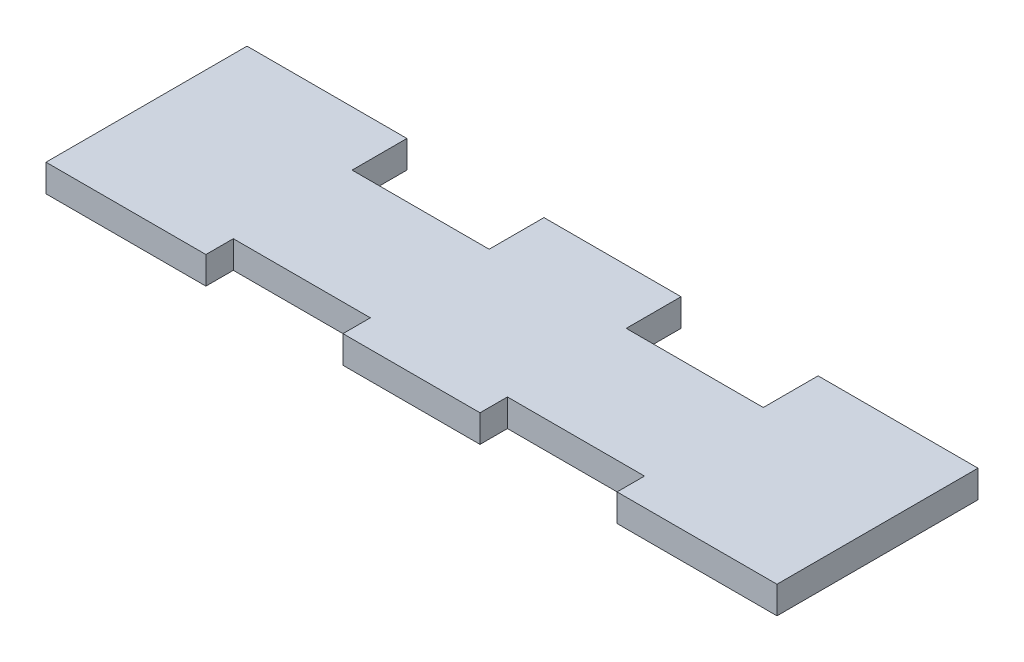
ISO-10303-21;
HEADER;
FILE_DESCRIPTION(('STEP AP214'),'2;1');
FILE_NAME('part.step','',(''),(''),'','','');
FILE_SCHEMA(('AUTOMOTIVE_DESIGN { 1 0 10303 214 1 1 1 1 }'));
ENDSEC;
DATA;
#1=APPLICATION_CONTEXT('core data for automotive mechanical design processes');
#2=APPLICATION_PROTOCOL_DEFINITION('international standard','automotive_design',2000,#1);
#3=PRODUCT_CONTEXT('',#1,'mechanical');
#4=PRODUCT('Part','Part','',(#3));
#5=PRODUCT_RELATED_PRODUCT_CATEGORY('part','',(#4));
#6=PRODUCT_DEFINITION_FORMATION('','',#4);
#7=PRODUCT_DEFINITION_CONTEXT('part definition',#1,'design');
#8=PRODUCT_DEFINITION('design','',#6,#7);
#9=PRODUCT_DEFINITION_SHAPE('','',#8);
#10=(LENGTH_UNIT() NAMED_UNIT(*) SI_UNIT(.MILLI.,.METRE.));
#11=(NAMED_UNIT(*) PLANE_ANGLE_UNIT() SI_UNIT($,.RADIAN.));
#12=(NAMED_UNIT(*) SI_UNIT($,.STERADIAN.) SOLID_ANGLE_UNIT());
#13=UNCERTAINTY_MEASURE_WITH_UNIT(LENGTH_MEASURE(1.E-05),#10,'distance_accuracy_value','');
#14=(GEOMETRIC_REPRESENTATION_CONTEXT(3) GLOBAL_UNCERTAINTY_ASSIGNED_CONTEXT((#13)) GLOBAL_UNIT_ASSIGNED_CONTEXT((#10,
#11,#12)) REPRESENTATION_CONTEXT('',''));
#15=CARTESIAN_POINT('',(0.,0.,0.));
#16=DIRECTION('',(0.,0.,1.));
#17=DIRECTION('',(1.,0.,0.));
#18=AXIS2_PLACEMENT_3D('',#15,#16,#17);
#19=CARTESIAN_POINT('',(0.,3.,0.));
#20=DIRECTION('',(1.,0.,0.));
#21=DIRECTION('',(0.,0.,-1.));
#22=AXIS2_PLACEMENT_3D('',#19,#20,#21);
#23=PLANE('',#22);
#24=DIRECTION('',(0.,0.,1.));
#25=VECTOR('',#24,1.);
#26=CARTESIAN_POINT('',(0.,0.,0.));
#27=LINE('',#26,#25);
#28=CARTESIAN_POINT('',(0.,0.,-22.));
#29=VERTEX_POINT('',#28);
#30=CARTESIAN_POINT('',(0.,0.,0.));
#31=VERTEX_POINT('',#30);
#32=EDGE_CURVE('E200',#29,#31,#27,.T.);
#33=ORIENTED_EDGE('',*,*,#32,.T.);
#34=DIRECTION('',(0.,-1.,0.));
#35=VECTOR('',#34,1.);
#36=CARTESIAN_POINT('',(0.,3.,0.));
#37=LINE('',#36,#35);
#38=CARTESIAN_POINT('',(0.,3.,0.));
#39=VERTEX_POINT('',#38);
#40=EDGE_CURVE('E11',#39,#31,#37,.T.);
#41=ORIENTED_EDGE('',*,*,#40,.F.);
#42=DIRECTION('',(0.,0.,1.));
#43=VECTOR('',#42,1.);
#44=CARTESIAN_POINT('',(0.,3.,0.));
#45=LINE('',#44,#43);
#46=CARTESIAN_POINT('',(0.,3.,-22.));
#47=VERTEX_POINT('',#46);
#48=EDGE_CURVE('E238',#47,#39,#45,.T.);
#49=ORIENTED_EDGE('',*,*,#48,.F.);
#50=DIRECTION('',(0.,-1.,0.));
#51=VECTOR('',#50,1.);
#52=CARTESIAN_POINT('',(0.,3.,-22.));
#53=LINE('',#52,#51);
#54=EDGE_CURVE('E196',#47,#29,#53,.T.);
#55=ORIENTED_EDGE('',*,*,#54,.T.);
#56=EDGE_LOOP('',(#33,#41,#49,#55));
#57=FACE_BOUND('',#56,.T.);
#58=ADVANCED_FACE('F32',(#57),#23,.F.);
#59=CARTESIAN_POINT('',(0.,3.,0.));
#60=DIRECTION('',(0.,0.,-1.));
#61=DIRECTION('',(-1.,0.,0.));
#62=AXIS2_PLACEMENT_3D('',#59,#60,#61);
#63=PLANE('',#62);
#64=DIRECTION('',(1.,0.,0.));
#65=VECTOR('',#64,1.);
#66=CARTESIAN_POINT('',(0.,0.,0.));
#67=LINE('',#66,#65);
#68=CARTESIAN_POINT('',(17.5,0.,0.));
#69=VERTEX_POINT('',#68);
#70=EDGE_CURVE('E203',#31,#69,#67,.T.);
#71=ORIENTED_EDGE('',*,*,#70,.T.);
#72=DIRECTION('',(0.,-1.,0.));
#73=VECTOR('',#72,1.);
#74=CARTESIAN_POINT('',(17.5,3.,0.));
#75=LINE('',#74,#73);
#76=CARTESIAN_POINT('',(17.5,3.,0.));
#77=VERTEX_POINT('',#76);
#78=EDGE_CURVE('E40',#77,#69,#75,.T.);
#79=ORIENTED_EDGE('',*,*,#78,.F.);
#80=DIRECTION('',(1.,0.,0.));
#81=VECTOR('',#80,1.);
#82=CARTESIAN_POINT('',(0.,3.,0.));
#83=LINE('',#82,#81);
#84=EDGE_CURVE('E127',#39,#77,#83,.T.);
#85=ORIENTED_EDGE('',*,*,#84,.F.);
#86=ORIENTED_EDGE('',*,*,#40,.T.);
#87=EDGE_LOOP('',(#71,#79,#85,#86));
#88=FACE_BOUND('',#87,.T.);
#89=ADVANCED_FACE('F356',(#88),#63,.F.);
#90=CARTESIAN_POINT('',(17.5,3.,0.));
#91=DIRECTION('',(-1.,0.,0.));
#92=DIRECTION('',(0.,0.,1.));
#93=AXIS2_PLACEMENT_3D('',#90,#91,#92);
#94=PLANE('',#93);
#95=DIRECTION('',(0.,0.,-1.));
#96=VECTOR('',#95,1.);
#97=CARTESIAN_POINT('',(17.5,0.,0.));
#98=LINE('',#97,#96);
#99=CARTESIAN_POINT('',(17.5,0.,-3.));
#100=VERTEX_POINT('',#99);
#101=EDGE_CURVE('E205',#69,#100,#98,.T.);
#102=ORIENTED_EDGE('',*,*,#101,.T.);
#103=DIRECTION('',(0.,-1.,0.));
#104=VECTOR('',#103,1.);
#105=CARTESIAN_POINT('',(17.5,3.,-3.));
#106=LINE('',#105,#104);
#107=CARTESIAN_POINT('',(17.5,3.,-3.));
#108=VERTEX_POINT('',#107);
#109=EDGE_CURVE('E281',#108,#100,#106,.T.);
#110=ORIENTED_EDGE('',*,*,#109,.F.);
#111=DIRECTION('',(0.,0.,-1.));
#112=VECTOR('',#111,1.);
#113=CARTESIAN_POINT('',(17.5,3.,0.));
#114=LINE('',#113,#112);
#115=EDGE_CURVE('E289',#77,#108,#114,.T.);
#116=ORIENTED_EDGE('',*,*,#115,.F.);
#117=ORIENTED_EDGE('',*,*,#78,.T.);
#118=EDGE_LOOP('',(#102,#110,#116,#117));
#119=FACE_BOUND('',#118,.T.);
#120=ADVANCED_FACE('F287',(#119),#94,.F.);
#121=CARTESIAN_POINT('',(17.5,3.,-3.));
#122=DIRECTION('',(0.,0.,-1.));
#123=DIRECTION('',(-1.,0.,0.));
#124=AXIS2_PLACEMENT_3D('',#121,#122,#123);
#125=PLANE('',#124);
#126=DIRECTION('',(1.,0.,0.));
#127=VECTOR('',#126,1.);
#128=CARTESIAN_POINT('',(17.5,0.,-3.));
#129=LINE('',#128,#127);
#130=CARTESIAN_POINT('',(32.5,0.,-3.));
#131=VERTEX_POINT('',#130);
#132=EDGE_CURVE('E207',#100,#131,#129,.T.);
#133=ORIENTED_EDGE('',*,*,#132,.T.);
#134=DIRECTION('',(0.,-1.,0.));
#135=VECTOR('',#134,1.);
#136=CARTESIAN_POINT('',(32.5,3.,-3.));
#137=LINE('',#136,#135);
#138=CARTESIAN_POINT('',(32.5,3.,-3.));
#139=VERTEX_POINT('',#138);
#140=EDGE_CURVE('E278',#139,#131,#137,.T.);
#141=ORIENTED_EDGE('',*,*,#140,.F.);
#142=DIRECTION('',(1.,0.,0.));
#143=VECTOR('',#142,1.);
#144=CARTESIAN_POINT('',(17.5,3.,-3.));
#145=LINE('',#144,#143);
#146=EDGE_CURVE('E307',#108,#139,#145,.T.);
#147=ORIENTED_EDGE('',*,*,#146,.F.);
#148=ORIENTED_EDGE('',*,*,#109,.T.);
#149=EDGE_LOOP('',(#133,#141,#147,#148));
#150=FACE_BOUND('',#149,.T.);
#151=ADVANCED_FACE('F298',(#150),#125,.F.);
#152=CARTESIAN_POINT('',(32.5,3.,-3.));
#153=DIRECTION('',(1.,0.,0.));
#154=DIRECTION('',(0.,0.,-1.));
#155=AXIS2_PLACEMENT_3D('',#152,#153,#154);
#156=PLANE('',#155);
#157=DIRECTION('',(0.,0.,1.));
#158=VECTOR('',#157,1.);
#159=CARTESIAN_POINT('',(32.5,0.,-3.));
#160=LINE('',#159,#158);
#161=CARTESIAN_POINT('',(32.5,0.,0.));
#162=VERTEX_POINT('',#161);
#163=EDGE_CURVE('E209',#131,#162,#160,.T.);
#164=ORIENTED_EDGE('',*,*,#163,.T.);
#165=DIRECTION('',(0.,-1.,0.));
#166=VECTOR('',#165,1.);
#167=CARTESIAN_POINT('',(32.5,3.,0.));
#168=LINE('',#167,#166);
#169=CARTESIAN_POINT('',(32.5,3.,0.));
#170=VERTEX_POINT('',#169);
#171=EDGE_CURVE('E275',#170,#162,#168,.T.);
#172=ORIENTED_EDGE('',*,*,#171,.F.);
#173=DIRECTION('',(0.,0.,1.));
#174=VECTOR('',#173,1.);
#175=CARTESIAN_POINT('',(32.5,3.,-3.));
#176=LINE('',#175,#174);
#177=EDGE_CURVE('E304',#139,#170,#176,.T.);
#178=ORIENTED_EDGE('',*,*,#177,.F.);
#179=ORIENTED_EDGE('',*,*,#140,.T.);
#180=EDGE_LOOP('',(#164,#172,#178,#179));
#181=FACE_BOUND('',#180,.T.);
#182=ADVANCED_FACE('F302',(#181),#156,.F.);
#183=CARTESIAN_POINT('',(32.5,3.,0.));
#184=DIRECTION('',(0.,0.,-1.));
#185=DIRECTION('',(-1.,0.,0.));
#186=AXIS2_PLACEMENT_3D('',#183,#184,#185);
#187=PLANE('',#186);
#188=DIRECTION('',(1.,0.,0.));
#189=VECTOR('',#188,1.);
#190=CARTESIAN_POINT('',(32.5,0.,0.));
#191=LINE('',#190,#189);
#192=CARTESIAN_POINT('',(47.5,0.,0.));
#193=VERTEX_POINT('',#192);
#194=EDGE_CURVE('E211',#162,#193,#191,.T.);
#195=ORIENTED_EDGE('',*,*,#194,.T.);
#196=DIRECTION('',(0.,-1.,0.));
#197=VECTOR('',#196,1.);
#198=CARTESIAN_POINT('',(47.5,3.,0.));
#199=LINE('',#198,#197);
#200=CARTESIAN_POINT('',(47.5,3.,0.));
#201=VERTEX_POINT('',#200);
#202=EDGE_CURVE('E272',#201,#193,#199,.T.);
#203=ORIENTED_EDGE('',*,*,#202,.F.);
#204=DIRECTION('',(1.,0.,0.));
#205=VECTOR('',#204,1.);
#206=CARTESIAN_POINT('',(32.5,3.,0.));
#207=LINE('',#206,#205);
#208=EDGE_CURVE('E306',#170,#201,#207,.T.);
#209=ORIENTED_EDGE('',*,*,#208,.F.);
#210=ORIENTED_EDGE('',*,*,#171,.T.);
#211=EDGE_LOOP('',(#195,#203,#209,#210));
#212=FACE_BOUND('',#211,.T.);
#213=ADVANCED_FACE('F369',(#212),#187,.F.);
#214=CARTESIAN_POINT('',(47.5,3.,-3.));
#215=DIRECTION('',(-1.,0.,0.));
#216=DIRECTION('',(0.,0.,1.));
#217=AXIS2_PLACEMENT_3D('',#214,#215,#216);
#218=PLANE('',#217);
#219=DIRECTION('',(0.,0.,-1.));
#220=VECTOR('',#219,1.);
#221=CARTESIAN_POINT('',(47.5,0.,-3.));
#222=LINE('',#221,#220);
#223=CARTESIAN_POINT('',(47.5,0.,-3.));
#224=VERTEX_POINT('',#223);
#225=EDGE_CURVE('E213',#193,#224,#222,.T.);
#226=ORIENTED_EDGE('',*,*,#225,.T.);
#227=DIRECTION('',(0.,-1.,0.));
#228=VECTOR('',#227,1.);
#229=CARTESIAN_POINT('',(47.5,3.,-3.));
#230=LINE('',#229,#228);
#231=CARTESIAN_POINT('',(47.5,3.,-3.));
#232=VERTEX_POINT('',#231);
#233=EDGE_CURVE('E269',#232,#224,#230,.T.);
#234=ORIENTED_EDGE('',*,*,#233,.F.);
#235=DIRECTION('',(0.,0.,-1.));
#236=VECTOR('',#235,1.);
#237=CARTESIAN_POINT('',(47.5,3.,-3.));
#238=LINE('',#237,#236);
#239=EDGE_CURVE('E309',#201,#232,#238,.T.);
#240=ORIENTED_EDGE('',*,*,#239,.F.);
#241=ORIENTED_EDGE('',*,*,#202,.T.);
#242=EDGE_LOOP('',(#226,#234,#240,#241));
#243=FACE_BOUND('',#242,.T.);
#244=ADVANCED_FACE('F372',(#243),#218,.F.);
#245=CARTESIAN_POINT('',(62.5,3.,-3.));
#246=DIRECTION('',(0.,0.,-1.));
#247=DIRECTION('',(-1.,0.,0.));
#248=AXIS2_PLACEMENT_3D('',#245,#246,#247);
#249=PLANE('',#248);
#250=DIRECTION('',(1.,0.,0.));
#251=VECTOR('',#250,1.);
#252=CARTESIAN_POINT('',(62.5,0.,-3.));
#253=LINE('',#252,#251);
#254=CARTESIAN_POINT('',(62.5,0.,-3.));
#255=VERTEX_POINT('',#254);
#256=EDGE_CURVE('E215',#224,#255,#253,.T.);
#257=ORIENTED_EDGE('',*,*,#256,.T.);
#258=DIRECTION('',(0.,-1.,0.));
#259=VECTOR('',#258,1.);
#260=CARTESIAN_POINT('',(62.5,3.,-3.));
#261=LINE('',#260,#259);
#262=CARTESIAN_POINT('',(62.5,3.,-3.));
#263=VERTEX_POINT('',#262);
#264=EDGE_CURVE('E266',#263,#255,#261,.T.);
#265=ORIENTED_EDGE('',*,*,#264,.F.);
#266=DIRECTION('',(1.,0.,0.));
#267=VECTOR('',#266,1.);
#268=CARTESIAN_POINT('',(62.5,3.,-3.));
#269=LINE('',#268,#267);
#270=EDGE_CURVE('E315',#232,#263,#269,.T.);
#271=ORIENTED_EDGE('',*,*,#270,.F.);
#272=ORIENTED_EDGE('',*,*,#233,.T.);
#273=EDGE_LOOP('',(#257,#265,#271,#272));
#274=FACE_BOUND('',#273,.T.);
#275=ADVANCED_FACE('F376',(#274),#249,.F.);
#276=CARTESIAN_POINT('',(62.5,3.,0.));
#277=DIRECTION('',(1.,0.,0.));
#278=DIRECTION('',(0.,0.,-1.));
#279=AXIS2_PLACEMENT_3D('',#276,#277,#278);
#280=PLANE('',#279);
#281=DIRECTION('',(0.,0.,1.));
#282=VECTOR('',#281,1.);
#283=CARTESIAN_POINT('',(62.5,0.,0.));
#284=LINE('',#283,#282);
#285=CARTESIAN_POINT('',(62.5,0.,0.));
#286=VERTEX_POINT('',#285);
#287=EDGE_CURVE('E217',#255,#286,#284,.T.);
#288=ORIENTED_EDGE('',*,*,#287,.T.);
#289=DIRECTION('',(0.,-1.,0.));
#290=VECTOR('',#289,1.);
#291=CARTESIAN_POINT('',(62.5,3.,0.));
#292=LINE('',#291,#290);
#293=CARTESIAN_POINT('',(62.5,3.,0.));
#294=VERTEX_POINT('',#293);
#295=EDGE_CURVE('E263',#294,#286,#292,.T.);
#296=ORIENTED_EDGE('',*,*,#295,.F.);
#297=DIRECTION('',(0.,0.,1.));
#298=VECTOR('',#297,1.);
#299=CARTESIAN_POINT('',(62.5,3.,0.));
#300=LINE('',#299,#298);
#301=EDGE_CURVE('E317',#263,#294,#300,.T.);
#302=ORIENTED_EDGE('',*,*,#301,.F.);
#303=ORIENTED_EDGE('',*,*,#264,.T.);
#304=EDGE_LOOP('',(#288,#296,#302,#303));
#305=FACE_BOUND('',#304,.T.);
#306=ADVANCED_FACE('F380',(#305),#280,.F.);
#307=CARTESIAN_POINT('',(80.,3.,0.));
#308=DIRECTION('',(0.,0.,-1.));
#309=DIRECTION('',(-1.,0.,0.));
#310=AXIS2_PLACEMENT_3D('',#307,#308,#309);
#311=PLANE('',#310);
#312=DIRECTION('',(1.,0.,0.));
#313=VECTOR('',#312,1.);
#314=CARTESIAN_POINT('',(80.,0.,0.));
#315=LINE('',#314,#313);
#316=CARTESIAN_POINT('',(80.,0.,0.));
#317=VERTEX_POINT('',#316);
#318=EDGE_CURVE('E219',#286,#317,#315,.T.);
#319=ORIENTED_EDGE('',*,*,#318,.T.);
#320=DIRECTION('',(0.,-1.,0.));
#321=VECTOR('',#320,1.);
#322=CARTESIAN_POINT('',(80.,3.,0.));
#323=LINE('',#322,#321);
#324=CARTESIAN_POINT('',(80.,3.,0.));
#325=VERTEX_POINT('',#324);
#326=EDGE_CURVE('E260',#325,#317,#323,.T.);
#327=ORIENTED_EDGE('',*,*,#326,.F.);
#328=DIRECTION('',(1.,0.,0.));
#329=VECTOR('',#328,1.);
#330=CARTESIAN_POINT('',(80.,3.,0.));
#331=LINE('',#330,#329);
#332=EDGE_CURVE('E319',#294,#325,#331,.T.);
#333=ORIENTED_EDGE('',*,*,#332,.F.);
#334=ORIENTED_EDGE('',*,*,#295,.T.);
#335=EDGE_LOOP('',(#319,#327,#333,#334));
#336=FACE_BOUND('',#335,.T.);
#337=ADVANCED_FACE('F384',(#336),#311,.F.);
#338=CARTESIAN_POINT('',(80.,3.,-22.));
#339=DIRECTION('',(-1.,0.,0.));
#340=DIRECTION('',(0.,0.,1.));
#341=AXIS2_PLACEMENT_3D('',#338,#339,#340);
#342=PLANE('',#341);
#343=DIRECTION('',(0.,0.,-1.));
#344=VECTOR('',#343,1.);
#345=CARTESIAN_POINT('',(80.,0.,-22.));
#346=LINE('',#345,#344);
#347=CARTESIAN_POINT('',(80.,0.,-22.));
#348=VERTEX_POINT('',#347);
#349=EDGE_CURVE('E221',#317,#348,#346,.T.);
#350=ORIENTED_EDGE('',*,*,#349,.T.);
#351=DIRECTION('',(0.,-1.,0.));
#352=VECTOR('',#351,1.);
#353=CARTESIAN_POINT('',(80.,3.,-22.));
#354=LINE('',#353,#352);
#355=CARTESIAN_POINT('',(80.,3.,-22.));
#356=VERTEX_POINT('',#355);
#357=EDGE_CURVE('E257',#356,#348,#354,.T.);
#358=ORIENTED_EDGE('',*,*,#357,.F.);
#359=DIRECTION('',(0.,0.,-1.));
#360=VECTOR('',#359,1.);
#361=CARTESIAN_POINT('',(80.,3.,-22.));
#362=LINE('',#361,#360);
#363=EDGE_CURVE('E321',#325,#356,#362,.T.);
#364=ORIENTED_EDGE('',*,*,#363,.F.);
#365=ORIENTED_EDGE('',*,*,#326,.T.);
#366=EDGE_LOOP('',(#350,#358,#364,#365));
#367=FACE_BOUND('',#366,.T.);
#368=ADVANCED_FACE('F388',(#367),#342,.F.);
#369=CARTESIAN_POINT('',(62.5,3.,-22.));
#370=DIRECTION('',(0.,0.,1.));
#371=DIRECTION('',(1.,0.,0.));
#372=AXIS2_PLACEMENT_3D('',#369,#370,#371);
#373=PLANE('',#372);
#374=DIRECTION('',(-1.,0.,0.));
#375=VECTOR('',#374,1.);
#376=CARTESIAN_POINT('',(62.5,0.,-22.));
#377=LINE('',#376,#375);
#378=CARTESIAN_POINT('',(62.5,0.,-22.));
#379=VERTEX_POINT('',#378);
#380=EDGE_CURVE('E223',#348,#379,#377,.T.);
#381=ORIENTED_EDGE('',*,*,#380,.T.);
#382=DIRECTION('',(0.,-1.,0.));
#383=VECTOR('',#382,1.);
#384=CARTESIAN_POINT('',(62.5,3.,-22.));
#385=LINE('',#384,#383);
#386=CARTESIAN_POINT('',(62.5,3.,-22.));
#387=VERTEX_POINT('',#386);
#388=EDGE_CURVE('E254',#387,#379,#385,.T.);
#389=ORIENTED_EDGE('',*,*,#388,.F.);
#390=DIRECTION('',(-1.,0.,0.));
#391=VECTOR('',#390,1.);
#392=CARTESIAN_POINT('',(62.5,3.,-22.));
#393=LINE('',#392,#391);
#394=EDGE_CURVE('E323',#356,#387,#393,.T.);
#395=ORIENTED_EDGE('',*,*,#394,.F.);
#396=ORIENTED_EDGE('',*,*,#357,.T.);
#397=EDGE_LOOP('',(#381,#389,#395,#396));
#398=FACE_BOUND('',#397,.T.);
#399=ADVANCED_FACE('F392',(#398),#373,.F.);
#400=CARTESIAN_POINT('',(62.5,3.,-16.));
#401=DIRECTION('',(1.,0.,0.));
#402=DIRECTION('',(0.,0.,-1.));
#403=AXIS2_PLACEMENT_3D('',#400,#401,#402);
#404=PLANE('',#403);
#405=DIRECTION('',(0.,0.,1.));
#406=VECTOR('',#405,1.);
#407=CARTESIAN_POINT('',(62.5,0.,-16.));
#408=LINE('',#407,#406);
#409=CARTESIAN_POINT('',(62.5,0.,-16.));
#410=VERTEX_POINT('',#409);
#411=EDGE_CURVE('E225',#379,#410,#408,.T.);
#412=ORIENTED_EDGE('',*,*,#411,.T.);
#413=DIRECTION('',(0.,-1.,0.));
#414=VECTOR('',#413,1.);
#415=CARTESIAN_POINT('',(62.5,3.,-16.));
#416=LINE('',#415,#414);
#417=CARTESIAN_POINT('',(62.5,3.,-16.));
#418=VERTEX_POINT('',#417);
#419=EDGE_CURVE('E251',#418,#410,#416,.T.);
#420=ORIENTED_EDGE('',*,*,#419,.F.);
#421=DIRECTION('',(0.,0.,1.));
#422=VECTOR('',#421,1.);
#423=CARTESIAN_POINT('',(62.5,3.,-16.));
#424=LINE('',#423,#422);
#425=EDGE_CURVE('E325',#387,#418,#424,.T.);
#426=ORIENTED_EDGE('',*,*,#425,.F.);
#427=ORIENTED_EDGE('',*,*,#388,.T.);
#428=EDGE_LOOP('',(#412,#420,#426,#427));
#429=FACE_BOUND('',#428,.T.);
#430=ADVANCED_FACE('F396',(#429),#404,.F.);
#431=CARTESIAN_POINT('',(47.5,3.,-16.));
#432=DIRECTION('',(0.,0.,1.));
#433=DIRECTION('',(1.,0.,0.));
#434=AXIS2_PLACEMENT_3D('',#431,#432,#433);
#435=PLANE('',#434);
#436=DIRECTION('',(-1.,0.,0.));
#437=VECTOR('',#436,1.);
#438=CARTESIAN_POINT('',(47.5,0.,-16.));
#439=LINE('',#438,#437);
#440=CARTESIAN_POINT('',(47.5,0.,-16.));
#441=VERTEX_POINT('',#440);
#442=EDGE_CURVE('E227',#410,#441,#439,.T.);
#443=ORIENTED_EDGE('',*,*,#442,.T.);
#444=DIRECTION('',(0.,-1.,0.));
#445=VECTOR('',#444,1.);
#446=CARTESIAN_POINT('',(47.5,3.,-16.));
#447=LINE('',#446,#445);
#448=CARTESIAN_POINT('',(47.5,3.,-16.));
#449=VERTEX_POINT('',#448);
#450=EDGE_CURVE('E248',#449,#441,#447,.T.);
#451=ORIENTED_EDGE('',*,*,#450,.F.);
#452=DIRECTION('',(-1.,0.,0.));
#453=VECTOR('',#452,1.);
#454=CARTESIAN_POINT('',(47.5,3.,-16.));
#455=LINE('',#454,#453);
#456=EDGE_CURVE('E327',#418,#449,#455,.T.);
#457=ORIENTED_EDGE('',*,*,#456,.F.);
#458=ORIENTED_EDGE('',*,*,#419,.T.);
#459=EDGE_LOOP('',(#443,#451,#457,#458));
#460=FACE_BOUND('',#459,.T.);
#461=ADVANCED_FACE('F400',(#460),#435,.F.);
#462=CARTESIAN_POINT('',(47.5,3.,-22.));
#463=DIRECTION('',(-1.,0.,0.));
#464=DIRECTION('',(0.,0.,1.));
#465=AXIS2_PLACEMENT_3D('',#462,#463,#464);
#466=PLANE('',#465);
#467=DIRECTION('',(0.,0.,-1.));
#468=VECTOR('',#467,1.);
#469=CARTESIAN_POINT('',(47.5,0.,-22.));
#470=LINE('',#469,#468);
#471=CARTESIAN_POINT('',(47.5,0.,-22.));
#472=VERTEX_POINT('',#471);
#473=EDGE_CURVE('E229',#441,#472,#470,.T.);
#474=ORIENTED_EDGE('',*,*,#473,.T.);
#475=DIRECTION('',(0.,-1.,0.));
#476=VECTOR('',#475,1.);
#477=CARTESIAN_POINT('',(47.5,3.,-22.));
#478=LINE('',#477,#476);
#479=CARTESIAN_POINT('',(47.5,3.,-22.));
#480=VERTEX_POINT('',#479);
#481=EDGE_CURVE('E245',#480,#472,#478,.T.);
#482=ORIENTED_EDGE('',*,*,#481,.F.);
#483=DIRECTION('',(0.,0.,-1.));
#484=VECTOR('',#483,1.);
#485=CARTESIAN_POINT('',(47.5,3.,-22.));
#486=LINE('',#485,#484);
#487=EDGE_CURVE('E329',#449,#480,#486,.T.);
#488=ORIENTED_EDGE('',*,*,#487,.F.);
#489=ORIENTED_EDGE('',*,*,#450,.T.);
#490=EDGE_LOOP('',(#474,#482,#488,#489));
#491=FACE_BOUND('',#490,.T.);
#492=ADVANCED_FACE('F404',(#491),#466,.F.);
#493=CARTESIAN_POINT('',(32.5,3.,-22.));
#494=DIRECTION('',(0.,0.,1.));
#495=DIRECTION('',(1.,0.,0.));
#496=AXIS2_PLACEMENT_3D('',#493,#494,#495);
#497=PLANE('',#496);
#498=DIRECTION('',(-1.,0.,0.));
#499=VECTOR('',#498,1.);
#500=CARTESIAN_POINT('',(32.5,0.,-22.));
#501=LINE('',#500,#499);
#502=CARTESIAN_POINT('',(32.5,0.,-22.));
#503=VERTEX_POINT('',#502);
#504=EDGE_CURVE('E231',#472,#503,#501,.T.);
#505=ORIENTED_EDGE('',*,*,#504,.T.);
#506=DIRECTION('',(0.,-1.,0.));
#507=VECTOR('',#506,1.);
#508=CARTESIAN_POINT('',(32.5,3.,-22.));
#509=LINE('',#508,#507);
#510=CARTESIAN_POINT('',(32.5,3.,-22.));
#511=VERTEX_POINT('',#510);
#512=EDGE_CURVE('E242',#511,#503,#509,.T.);
#513=ORIENTED_EDGE('',*,*,#512,.F.);
#514=DIRECTION('',(-1.,0.,0.));
#515=VECTOR('',#514,1.);
#516=CARTESIAN_POINT('',(32.5,3.,-22.));
#517=LINE('',#516,#515);
#518=EDGE_CURVE('E331',#480,#511,#517,.T.);
#519=ORIENTED_EDGE('',*,*,#518,.F.);
#520=ORIENTED_EDGE('',*,*,#481,.T.);
#521=EDGE_LOOP('',(#505,#513,#519,#520));
#522=FACE_BOUND('',#521,.T.);
#523=ADVANCED_FACE('F337',(#522),#497,.F.);
#524=CARTESIAN_POINT('',(32.5,3.,-16.));
#525=DIRECTION('',(1.,0.,0.));
#526=DIRECTION('',(0.,0.,-1.));
#527=AXIS2_PLACEMENT_3D('',#524,#525,#526);
#528=PLANE('',#527);
#529=DIRECTION('',(0.,0.,1.));
#530=VECTOR('',#529,1.);
#531=CARTESIAN_POINT('',(32.5,0.,-16.));
#532=LINE('',#531,#530);
#533=CARTESIAN_POINT('',(32.5,0.,-16.));
#534=VERTEX_POINT('',#533);
#535=EDGE_CURVE('E233',#503,#534,#532,.T.);
#536=ORIENTED_EDGE('',*,*,#535,.T.);
#537=DIRECTION('',(0.,-1.,0.));
#538=VECTOR('',#537,1.);
#539=CARTESIAN_POINT('',(32.5,3.,-16.));
#540=LINE('',#539,#538);
#541=CARTESIAN_POINT('',(32.5,3.,-16.));
#542=VERTEX_POINT('',#541);
#543=EDGE_CURVE('E191',#542,#534,#540,.T.);
#544=ORIENTED_EDGE('',*,*,#543,.F.);
#545=DIRECTION('',(0.,0.,1.));
#546=VECTOR('',#545,1.);
#547=CARTESIAN_POINT('',(32.5,3.,-16.));
#548=LINE('',#547,#546);
#549=EDGE_CURVE('E182',#511,#542,#548,.T.);
#550=ORIENTED_EDGE('',*,*,#549,.F.);
#551=ORIENTED_EDGE('',*,*,#512,.T.);
#552=EDGE_LOOP('',(#536,#544,#550,#551));
#553=FACE_BOUND('',#552,.T.);
#554=ADVANCED_FACE('F341',(#553),#528,.F.);
#555=CARTESIAN_POINT('',(17.5,3.,-16.));
#556=DIRECTION('',(0.,0.,1.));
#557=DIRECTION('',(1.,0.,0.));
#558=AXIS2_PLACEMENT_3D('',#555,#556,#557);
#559=PLANE('',#558);
#560=DIRECTION('',(-1.,0.,0.));
#561=VECTOR('',#560,1.);
#562=CARTESIAN_POINT('',(17.5,0.,-16.));
#563=LINE('',#562,#561);
#564=CARTESIAN_POINT('',(17.5,0.,-16.));
#565=VERTEX_POINT('',#564);
#566=EDGE_CURVE('E190',#534,#565,#563,.T.);
#567=ORIENTED_EDGE('',*,*,#566,.T.);
#568=DIRECTION('',(0.,-1.,0.));
#569=VECTOR('',#568,1.);
#570=CARTESIAN_POINT('',(17.5,3.,-16.));
#571=LINE('',#570,#569);
#572=CARTESIAN_POINT('',(17.5,3.,-16.));
#573=VERTEX_POINT('',#572);
#574=EDGE_CURVE('E187',#573,#565,#571,.T.);
#575=ORIENTED_EDGE('',*,*,#574,.F.);
#576=DIRECTION('',(-1.,0.,0.));
#577=VECTOR('',#576,1.);
#578=CARTESIAN_POINT('',(17.5,3.,-16.));
#579=LINE('',#578,#577);
#580=EDGE_CURVE('E176',#542,#573,#579,.T.);
#581=ORIENTED_EDGE('',*,*,#580,.F.);
#582=ORIENTED_EDGE('',*,*,#543,.T.);
#583=EDGE_LOOP('',(#567,#575,#581,#582));
#584=FACE_BOUND('',#583,.T.);
#585=ADVANCED_FACE('F188',(#584),#559,.F.);
#586=CARTESIAN_POINT('',(17.5,3.,-22.));
#587=DIRECTION('',(-1.,0.,0.));
#588=DIRECTION('',(0.,0.,1.));
#589=AXIS2_PLACEMENT_3D('',#586,#587,#588);
#590=PLANE('',#589);
#591=DIRECTION('',(0.,0.,-1.));
#592=VECTOR('',#591,1.);
#593=CARTESIAN_POINT('',(17.5,0.,-22.));
#594=LINE('',#593,#592);
#595=CARTESIAN_POINT('',(17.5,0.,-22.));
#596=VERTEX_POINT('',#595);
#597=EDGE_CURVE('E113',#565,#596,#594,.T.);
#598=ORIENTED_EDGE('',*,*,#597,.T.);
#599=DIRECTION('',(0.,-1.,0.));
#600=VECTOR('',#599,1.);
#601=CARTESIAN_POINT('',(17.5,3.,-22.));
#602=LINE('',#601,#600);
#603=CARTESIAN_POINT('',(17.5,3.,-22.));
#604=VERTEX_POINT('',#603);
#605=EDGE_CURVE('E192',#604,#596,#602,.T.);
#606=ORIENTED_EDGE('',*,*,#605,.F.);
#607=DIRECTION('',(0.,0.,-1.));
#608=VECTOR('',#607,1.);
#609=CARTESIAN_POINT('',(17.5,3.,-22.));
#610=LINE('',#609,#608);
#611=EDGE_CURVE('E180',#573,#604,#610,.T.);
#612=ORIENTED_EDGE('',*,*,#611,.F.);
#613=ORIENTED_EDGE('',*,*,#574,.T.);
#614=EDGE_LOOP('',(#598,#606,#612,#613));
#615=FACE_BOUND('',#614,.T.);
#616=ADVANCED_FACE('F194',(#615),#590,.F.);
#617=CARTESIAN_POINT('',(0.,3.,-22.));
#618=DIRECTION('',(0.,0.,1.));
#619=DIRECTION('',(1.,0.,0.));
#620=AXIS2_PLACEMENT_3D('',#617,#618,#619);
#621=PLANE('',#620);
#622=DIRECTION('',(-1.,0.,0.));
#623=VECTOR('',#622,1.);
#624=CARTESIAN_POINT('',(0.,0.,-22.));
#625=LINE('',#624,#623);
#626=EDGE_CURVE('E119',#596,#29,#625,.T.);
#627=ORIENTED_EDGE('',*,*,#626,.T.);
#628=ORIENTED_EDGE('',*,*,#54,.F.);
#629=DIRECTION('',(-1.,0.,0.));
#630=VECTOR('',#629,1.);
#631=CARTESIAN_POINT('',(0.,3.,-22.));
#632=LINE('',#631,#630);
#633=EDGE_CURVE('E48',#604,#47,#632,.T.);
#634=ORIENTED_EDGE('',*,*,#633,.F.);
#635=ORIENTED_EDGE('',*,*,#605,.T.);
#636=EDGE_LOOP('',(#627,#628,#634,#635));
#637=FACE_BOUND('',#636,.T.);
#638=ADVANCED_FACE('F345',(#637),#621,.F.);
#639=CARTESIAN_POINT('',(0.,3.,0.));
#640=DIRECTION('',(0.,-1.,0.));
#641=DIRECTION('',(0.,0.,-1.));
#642=AXIS2_PLACEMENT_3D('',#639,#640,#641);
#643=PLANE('',#642);
#644=ORIENTED_EDGE('',*,*,#48,.T.);
#645=ORIENTED_EDGE('',*,*,#84,.T.);
#646=ORIENTED_EDGE('',*,*,#115,.T.);
#647=ORIENTED_EDGE('',*,*,#146,.T.);
#648=ORIENTED_EDGE('',*,*,#177,.T.);
#649=ORIENTED_EDGE('',*,*,#208,.T.);
#650=ORIENTED_EDGE('',*,*,#239,.T.);
#651=ORIENTED_EDGE('',*,*,#270,.T.);
#652=ORIENTED_EDGE('',*,*,#301,.T.);
#653=ORIENTED_EDGE('',*,*,#332,.T.);
#654=ORIENTED_EDGE('',*,*,#363,.T.);
#655=ORIENTED_EDGE('',*,*,#394,.T.);
#656=ORIENTED_EDGE('',*,*,#425,.T.);
#657=ORIENTED_EDGE('',*,*,#456,.T.);
#658=ORIENTED_EDGE('',*,*,#487,.T.);
#659=ORIENTED_EDGE('',*,*,#518,.T.);
#660=ORIENTED_EDGE('',*,*,#549,.T.);
#661=ORIENTED_EDGE('',*,*,#580,.T.);
#662=ORIENTED_EDGE('',*,*,#611,.T.);
#663=ORIENTED_EDGE('',*,*,#633,.T.);
#664=EDGE_LOOP('',(#644,#645,#646,#647,#648,#649,#650,#651,#652,#653,#654,#655,#656,#657,#658,
#659,#660,#661,#662,#663));
#665=FACE_BOUND('',#664,.T.);
#666=ADVANCED_FACE('F178',(#665),#643,.F.);
#667=CARTESIAN_POINT('',(0.,0.,0.));
#668=DIRECTION('',(0.,-1.,0.));
#669=DIRECTION('',(0.,0.,-1.));
#670=AXIS2_PLACEMENT_3D('',#667,#668,#669);
#671=PLANE('',#670);
#672=ORIENTED_EDGE('',*,*,#32,.F.);
#673=ORIENTED_EDGE('',*,*,#626,.F.);
#674=ORIENTED_EDGE('',*,*,#597,.F.);
#675=ORIENTED_EDGE('',*,*,#566,.F.);
#676=ORIENTED_EDGE('',*,*,#535,.F.);
#677=ORIENTED_EDGE('',*,*,#504,.F.);
#678=ORIENTED_EDGE('',*,*,#473,.F.);
#679=ORIENTED_EDGE('',*,*,#442,.F.);
#680=ORIENTED_EDGE('',*,*,#411,.F.);
#681=ORIENTED_EDGE('',*,*,#380,.F.);
#682=ORIENTED_EDGE('',*,*,#349,.F.);
#683=ORIENTED_EDGE('',*,*,#318,.F.);
#684=ORIENTED_EDGE('',*,*,#287,.F.);
#685=ORIENTED_EDGE('',*,*,#256,.F.);
#686=ORIENTED_EDGE('',*,*,#225,.F.);
#687=ORIENTED_EDGE('',*,*,#194,.F.);
#688=ORIENTED_EDGE('',*,*,#163,.F.);
#689=ORIENTED_EDGE('',*,*,#132,.F.);
#690=ORIENTED_EDGE('',*,*,#101,.F.);
#691=ORIENTED_EDGE('',*,*,#70,.F.);
#692=EDGE_LOOP('',(#672,#673,#674,#675,#676,#677,#678,#679,#680,#681,#682,#683,#684,#685,#686,
#687,#688,#689,#690,#691));
#693=FACE_BOUND('',#692,.T.);
#694=ADVANCED_FACE('F293',(#693),#671,.T.);
#695=CLOSED_SHELL('',(#58,#89,#120,#151,#182,#213,#244,#275,#306,#337,#368,#399,#430,#461,#492,
#523,#554,#585,#616,#638,#666,#694));
#696=MANIFOLD_SOLID_BREP('B2',#695);
#697=ADVANCED_BREP_SHAPE_REPRESENTATION('',(#18,#696),#14);
#698=SHAPE_DEFINITION_REPRESENTATION(#9,#697);
ENDSEC;
END-ISO-10303-21;
